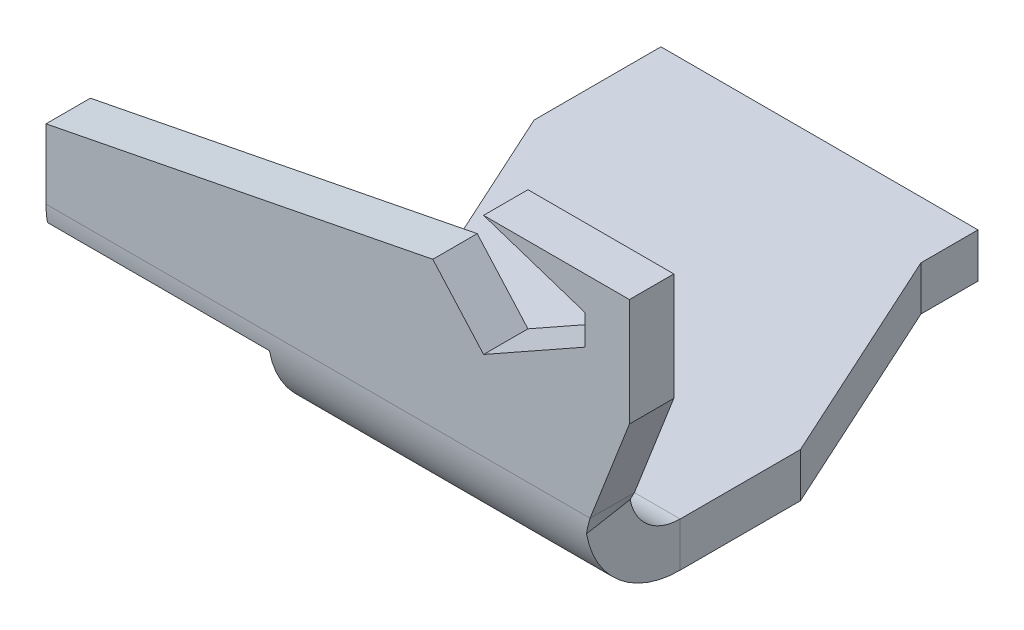
ISO-10303-21;
HEADER;
FILE_DESCRIPTION(('STEP AP214'),'2;1');
FILE_NAME('part.step','',(''),(''),'','','');
FILE_SCHEMA(('AUTOMOTIVE_DESIGN { 1 0 10303 214 1 1 1 1 }'));
ENDSEC;
DATA;
#1=APPLICATION_CONTEXT('core data for automotive mechanical design processes');
#2=APPLICATION_PROTOCOL_DEFINITION('international standard','automotive_design',2000,#1);
#3=PRODUCT_CONTEXT('',#1,'mechanical');
#4=PRODUCT('Part','Part','',(#3));
#5=PRODUCT_RELATED_PRODUCT_CATEGORY('part','',(#4));
#6=PRODUCT_DEFINITION_FORMATION('','',#4);
#7=PRODUCT_DEFINITION_CONTEXT('part definition',#1,'design');
#8=PRODUCT_DEFINITION('design','',#6,#7);
#9=PRODUCT_DEFINITION_SHAPE('','',#8);
#10=(LENGTH_UNIT() NAMED_UNIT(*) SI_UNIT(.MILLI.,.METRE.));
#11=(NAMED_UNIT(*) PLANE_ANGLE_UNIT() SI_UNIT($,.RADIAN.));
#12=(NAMED_UNIT(*) SI_UNIT($,.STERADIAN.) SOLID_ANGLE_UNIT());
#13=UNCERTAINTY_MEASURE_WITH_UNIT(LENGTH_MEASURE(1.E-05),#10,'distance_accuracy_value','');
#14=(GEOMETRIC_REPRESENTATION_CONTEXT(3) GLOBAL_UNCERTAINTY_ASSIGNED_CONTEXT((#13)) GLOBAL_UNIT_ASSIGNED_CONTEXT((#10,
#11,#12)) REPRESENTATION_CONTEXT('',''));
#15=CARTESIAN_POINT('',(0.,0.,0.));
#16=DIRECTION('',(0.,0.,1.));
#17=DIRECTION('',(1.,0.,0.));
#18=AXIS2_PLACEMENT_3D('',#15,#16,#17);
#19=CARTESIAN_POINT('',(3.5,-1.29679211209293,-1.59679211209294));
#20=DIRECTION('',(1.,0.,0.));
#21=DIRECTION('',(0.,0.,1.));
#22=AXIS2_PLACEMENT_3D('',#19,#20,#21);
#23=PLANE('',#22);
#24=DIRECTION('',(0.,0.,1.));
#25=VECTOR('',#24,1.);
#26=CARTESIAN_POINT('',(3.5,-1.29679211209293,-1.59679211209294));
#27=LINE('',#26,#25);
#28=CARTESIAN_POINT('',(3.5,-1.29679211209293,-1.59679211209294));
#29=VERTEX_POINT('',#28);
#30=CARTESIAN_POINT('',(3.5,-1.29679211209293,-0.800000000000006));
#31=VERTEX_POINT('',#30);
#32=EDGE_CURVE('E206',#29,#31,#27,.T.);
#33=ORIENTED_EDGE('',*,*,#32,.T.);
#34=DIRECTION('',(0.,1.,0.));
#35=VECTOR('',#34,1.);
#36=CARTESIAN_POINT('',(3.5,-1.29679211209293,-0.800000000000008));
#37=LINE('',#36,#35);
#38=CARTESIAN_POINT('',(3.5,-0.596792112092931,-0.800000000000001));
#39=VERTEX_POINT('',#38);
#40=EDGE_CURVE('E12',#31,#39,#37,.T.);
#41=ORIENTED_EDGE('',*,*,#40,.T.);
#42=DIRECTION('',(0.,0.,1.));
#43=VECTOR('',#42,1.);
#44=CARTESIAN_POINT('',(3.5,-0.596792112092934,0.80320788790706));
#45=LINE('',#44,#43);
#46=CARTESIAN_POINT('',(3.5,-0.596792112092925,-1.59679211209294));
#47=VERTEX_POINT('',#46);
#48=EDGE_CURVE('E236',#47,#39,#45,.T.);
#49=ORIENTED_EDGE('',*,*,#48,.F.);
#50=DIRECTION('',(0.,-1.,0.));
#51=VECTOR('',#50,1.);
#52=CARTESIAN_POINT('',(3.5,-1.29679211209293,-1.59679211209294));
#53=LINE('',#52,#51);
#54=EDGE_CURVE('E73',#47,#29,#53,.T.);
#55=ORIENTED_EDGE('',*,*,#54,.T.);
#56=EDGE_LOOP('',(#33,#41,#49,#55));
#57=FACE_BOUND('',#56,.T.);
#58=ADVANCED_FACE('F48',(#57),#23,.F.);
#59=CARTESIAN_POINT('',(8.5,-1.29679211209293,0.80320788790706));
#60=DIRECTION('',(-1.,0.,0.));
#61=DIRECTION('',(0.,0.,-1.));
#62=AXIS2_PLACEMENT_3D('',#59,#60,#61);
#63=PLANE('',#62);
#64=DIRECTION('',(0.,0.,1.));
#65=VECTOR('',#64,1.);
#66=CARTESIAN_POINT('',(8.5,-0.596792112092934,0.80320788790706));
#67=LINE('',#66,#65);
#68=CARTESIAN_POINT('',(8.5,-0.596792112092931,-0.800000000000001));
#69=VERTEX_POINT('',#68);
#70=CARTESIAN_POINT('',(8.5,-0.596792112092921,-2.69679211209294));
#71=VERTEX_POINT('',#70);
#72=EDGE_CURVE('E215',#69,#71,#67,.F.);
#73=ORIENTED_EDGE('',*,*,#72,.F.);
#74=DIRECTION('',(0.,-1.,0.));
#75=VECTOR('',#74,1.);
#76=CARTESIAN_POINT('',(8.5,-1.29679211209292,-0.800000000000008));
#77=LINE('',#76,#75);
#78=CARTESIAN_POINT('',(8.5,-1.29679211209293,-0.800000000000002));
#79=VERTEX_POINT('',#78);
#80=EDGE_CURVE('E230',#69,#79,#77,.T.);
#81=ORIENTED_EDGE('',*,*,#80,.T.);
#82=DIRECTION('',(0.,0.,-1.));
#83=VECTOR('',#82,1.);
#84=CARTESIAN_POINT('',(8.5,-1.29679211209293,0.80320788790706));
#85=LINE('',#84,#83);
#86=CARTESIAN_POINT('',(8.5,-1.29679211209292,-2.69679211209294));
#87=VERTEX_POINT('',#86);
#88=EDGE_CURVE('E51',#79,#87,#85,.T.);
#89=ORIENTED_EDGE('',*,*,#88,.T.);
#90=DIRECTION('',(0.,-1.,0.));
#91=VECTOR('',#90,1.);
#92=CARTESIAN_POINT('',(8.5,-1.29679211209292,-2.69679211209294));
#93=LINE('',#92,#91);
#94=EDGE_CURVE('E190',#71,#87,#93,.T.);
#95=ORIENTED_EDGE('',*,*,#94,.F.);
#96=EDGE_LOOP('',(#73,#81,#89,#95));
#97=FACE_BOUND('',#96,.T.);
#98=ADVANCED_FACE('F245',(#97),#63,.F.);
#99=CARTESIAN_POINT('',(0.,-1.29679211209293,0.803207887907058));
#100=DIRECTION('',(0.,-1.,0.));
#101=DIRECTION('',(1.,0.,0.));
#102=AXIS2_PLACEMENT_3D('',#99,#100,#101);
#103=PLANE('',#102);
#104=ORIENTED_EDGE('',*,*,#88,.F.);
#105=DIRECTION('',(-1.,0.,0.));
#106=VECTOR('',#105,1.);
#107=CARTESIAN_POINT('',(0.,-1.29679211209293,-0.800000000000008));
#108=LINE('',#107,#106);
#109=EDGE_CURVE('E226',#79,#31,#108,.T.);
#110=ORIENTED_EDGE('',*,*,#109,.T.);
#111=ORIENTED_EDGE('',*,*,#32,.F.);
#112=DIRECTION('',(0.415759760267794,0.,0.9094744755858));
#113=VECTOR('',#112,1.);
#114=CARTESIAN_POINT('',(1.9,-1.29679211209291,-5.09679211209294));
#115=LINE('',#114,#113);
#116=CARTESIAN_POINT('',(1.9,-1.29679211209291,-5.09679211209294));
#117=VERTEX_POINT('',#116);
#118=EDGE_CURVE('E238',#117,#29,#115,.T.);
#119=ORIENTED_EDGE('',*,*,#118,.F.);
#120=DIRECTION('',(0.,0.,1.));
#121=VECTOR('',#120,1.);
#122=CARTESIAN_POINT('',(1.9,-1.29679211209291,-7.09679211209294));
#123=LINE('',#122,#121);
#124=CARTESIAN_POINT('',(1.9,-1.29679211209291,-7.09679211209294));
#125=VERTEX_POINT('',#124);
#126=EDGE_CURVE('E291',#125,#117,#123,.T.);
#127=ORIENTED_EDGE('',*,*,#126,.F.);
#128=DIRECTION('',(-1.,0.,0.));
#129=VECTOR('',#128,1.);
#130=CARTESIAN_POINT('',(6.9,-1.29679211209291,-7.09679211209294));
#131=LINE('',#130,#129);
#132=CARTESIAN_POINT('',(6.9,-1.29679211209291,-7.09679211209294));
#133=VERTEX_POINT('',#132);
#134=EDGE_CURVE('E200',#133,#125,#131,.T.);
#135=ORIENTED_EDGE('',*,*,#134,.F.);
#136=DIRECTION('',(0.,0.,-1.));
#137=VECTOR('',#136,1.);
#138=CARTESIAN_POINT('',(6.9,-1.29679211209291,-6.19679211209295));
#139=LINE('',#138,#137);
#140=CARTESIAN_POINT('',(6.9,-1.29679211209291,-6.19679211209295));
#141=VERTEX_POINT('',#140);
#142=EDGE_CURVE('E182',#141,#133,#139,.T.);
#143=ORIENTED_EDGE('',*,*,#142,.F.);
#144=DIRECTION('',(-0.415759760267794,0.,-0.909474475585801));
#145=VECTOR('',#144,1.);
#146=CARTESIAN_POINT('',(8.5,-1.29679211209292,-2.69679211209294));
#147=LINE('',#146,#145);
#148=EDGE_CURVE('E197',#87,#141,#147,.T.);
#149=ORIENTED_EDGE('',*,*,#148,.F.);
#150=EDGE_LOOP('',(#104,#110,#111,#119,#127,#135,#143,#149));
#151=FACE_BOUND('',#150,.T.);
#152=ADVANCED_FACE('F196',(#151),#103,.T.);
#153=CARTESIAN_POINT('',(6.9,-1.29679211209291,-7.09679211209294));
#154=DIRECTION('',(0.,0.,1.));
#155=DIRECTION('',(-1.,0.,0.));
#156=AXIS2_PLACEMENT_3D('',#153,#154,#155);
#157=PLANE('',#156);
#158=DIRECTION('',(0.,-1.,0.));
#159=VECTOR('',#158,1.);
#160=CARTESIAN_POINT('',(1.9,-1.29679211209291,-7.09679211209294));
#161=LINE('',#160,#159);
#162=CARTESIAN_POINT('',(1.9,-0.596792112092906,-7.09679211209294));
#163=VERTEX_POINT('',#162);
#164=EDGE_CURVE('E224',#163,#125,#161,.T.);
#165=ORIENTED_EDGE('',*,*,#164,.F.);
#166=DIRECTION('',(1.,0.,0.));
#167=VECTOR('',#166,1.);
#168=CARTESIAN_POINT('',(0.,-0.596792112092906,-7.09679211209294));
#169=LINE('',#168,#167);
#170=CARTESIAN_POINT('',(6.9,-0.596792112092906,-7.09679211209294));
#171=VERTEX_POINT('',#170);
#172=EDGE_CURVE('E217',#171,#163,#169,.F.);
#173=ORIENTED_EDGE('',*,*,#172,.F.);
#174=DIRECTION('',(0.,-1.,0.));
#175=VECTOR('',#174,1.);
#176=CARTESIAN_POINT('',(6.9,-1.29679211209291,-7.09679211209294));
#177=LINE('',#176,#175);
#178=EDGE_CURVE('E189',#171,#133,#177,.T.);
#179=ORIENTED_EDGE('',*,*,#178,.T.);
#180=ORIENTED_EDGE('',*,*,#134,.T.);
#181=EDGE_LOOP('',(#165,#173,#179,#180));
#182=FACE_BOUND('',#181,.T.);
#183=ADVANCED_FACE('F342',(#182),#157,.F.);
#184=CARTESIAN_POINT('',(6.9,-1.29679211209291,-6.19679211209295));
#185=DIRECTION('',(-1.,0.,0.));
#186=DIRECTION('',(0.,0.,-1.));
#187=AXIS2_PLACEMENT_3D('',#184,#185,#186);
#188=PLANE('',#187);
#189=ORIENTED_EDGE('',*,*,#178,.F.);
#190=DIRECTION('',(0.,0.,1.));
#191=VECTOR('',#190,1.);
#192=CARTESIAN_POINT('',(6.9,-0.596792112092934,0.80320788790706));
#193=LINE('',#192,#191);
#194=CARTESIAN_POINT('',(6.9,-0.596792112092909,-6.19679211209294));
#195=VERTEX_POINT('',#194);
#196=EDGE_CURVE('E184',#195,#171,#193,.F.);
#197=ORIENTED_EDGE('',*,*,#196,.F.);
#198=DIRECTION('',(0.,-1.,0.));
#199=VECTOR('',#198,1.);
#200=CARTESIAN_POINT('',(6.9,-1.29679211209291,-6.19679211209295));
#201=LINE('',#200,#199);
#202=EDGE_CURVE('E179',#195,#141,#201,.T.);
#203=ORIENTED_EDGE('',*,*,#202,.T.);
#204=ORIENTED_EDGE('',*,*,#142,.T.);
#205=EDGE_LOOP('',(#189,#197,#203,#204));
#206=FACE_BOUND('',#205,.T.);
#207=ADVANCED_FACE('F181',(#206),#188,.F.);
#208=CARTESIAN_POINT('',(8.5,-1.29679211209292,-2.69679211209294));
#209=DIRECTION('',(-0.909474475585801,0.,0.415759760267794));
#210=DIRECTION('',(-0.415759760267794,0.,-0.909474475585801));
#211=AXIS2_PLACEMENT_3D('',#208,#209,#210);
#212=PLANE('',#211);
#213=ORIENTED_EDGE('',*,*,#202,.F.);
#214=DIRECTION('',(-0.415759760267794,0.,-0.909474475585801));
#215=VECTOR('',#214,1.);
#216=CARTESIAN_POINT('',(8.5,-0.596792112092922,-2.69679211209294));
#217=LINE('',#216,#215);
#218=EDGE_CURVE('E213',#71,#195,#217,.T.);
#219=ORIENTED_EDGE('',*,*,#218,.F.);
#220=ORIENTED_EDGE('',*,*,#94,.T.);
#221=ORIENTED_EDGE('',*,*,#148,.T.);
#222=EDGE_LOOP('',(#213,#219,#220,#221));
#223=FACE_BOUND('',#222,.T.);
#224=ADVANCED_FACE('F203',(#223),#212,.F.);
#225=CARTESIAN_POINT('',(1.9,-1.29679211209291,-5.09679211209294));
#226=DIRECTION('',(0.9094744755858,0.,-0.415759760267794));
#227=DIRECTION('',(0.415759760267794,0.,0.9094744755858));
#228=AXIS2_PLACEMENT_3D('',#225,#226,#227);
#229=PLANE('',#228);
#230=ORIENTED_EDGE('',*,*,#54,.F.);
#231=DIRECTION('',(0.415759760267794,0.,0.9094744755858));
#232=VECTOR('',#231,1.);
#233=CARTESIAN_POINT('',(1.9,-0.596792112092913,-5.09679211209294));
#234=LINE('',#233,#232);
#235=CARTESIAN_POINT('',(1.9,-0.596792112092913,-5.09679211209294));
#236=VERTEX_POINT('',#235);
#237=EDGE_CURVE('E209',#236,#47,#234,.T.);
#238=ORIENTED_EDGE('',*,*,#237,.F.);
#239=DIRECTION('',(0.,-1.,0.));
#240=VECTOR('',#239,1.);
#241=CARTESIAN_POINT('',(1.9,-1.29679211209291,-5.09679211209294));
#242=LINE('',#241,#240);
#243=EDGE_CURVE('E101',#236,#117,#242,.T.);
#244=ORIENTED_EDGE('',*,*,#243,.T.);
#245=ORIENTED_EDGE('',*,*,#118,.T.);
#246=EDGE_LOOP('',(#230,#238,#244,#245));
#247=FACE_BOUND('',#246,.T.);
#248=ADVANCED_FACE('F335',(#247),#229,.F.);
#249=CARTESIAN_POINT('',(1.9,-1.29679211209291,-7.09679211209294));
#250=DIRECTION('',(1.,0.,0.));
#251=DIRECTION('',(0.,0.,1.));
#252=AXIS2_PLACEMENT_3D('',#249,#250,#251);
#253=PLANE('',#252);
#254=DIRECTION('',(0.,0.,1.));
#255=VECTOR('',#254,1.);
#256=CARTESIAN_POINT('',(1.9,-0.596792112092934,0.80320788790706));
#257=LINE('',#256,#255);
#258=EDGE_CURVE('E212',#163,#236,#257,.T.);
#259=ORIENTED_EDGE('',*,*,#258,.F.);
#260=ORIENTED_EDGE('',*,*,#164,.T.);
#261=ORIENTED_EDGE('',*,*,#126,.T.);
#262=ORIENTED_EDGE('',*,*,#243,.F.);
#263=EDGE_LOOP('',(#259,#260,#261,#262));
#264=FACE_BOUND('',#263,.T.);
#265=ADVANCED_FACE('F294',(#264),#253,.F.);
#266=CARTESIAN_POINT('',(0.,-0.596792112092934,0.80320788790706));
#267=DIRECTION('',(0.,-1.,0.));
#268=DIRECTION('',(1.,0.,0.));
#269=AXIS2_PLACEMENT_3D('',#266,#267,#268);
#270=PLANE('',#269);
#271=DIRECTION('',(-1.,0.,0.));
#272=VECTOR('',#271,1.);
#273=CARTESIAN_POINT('',(0.,-0.596792112092928,-0.800000000000001));
#274=LINE('',#273,#272);
#275=EDGE_CURVE('E56',#69,#39,#274,.T.);
#276=ORIENTED_EDGE('',*,*,#275,.F.);
#277=ORIENTED_EDGE('',*,*,#72,.T.);
#278=ORIENTED_EDGE('',*,*,#218,.T.);
#279=ORIENTED_EDGE('',*,*,#196,.T.);
#280=ORIENTED_EDGE('',*,*,#172,.T.);
#281=ORIENTED_EDGE('',*,*,#258,.T.);
#282=ORIENTED_EDGE('',*,*,#237,.T.);
#283=ORIENTED_EDGE('',*,*,#48,.T.);
#284=EDGE_LOOP('',(#276,#277,#278,#279,#280,#281,#282,#283));
#285=FACE_BOUND('',#284,.T.);
#286=ADVANCED_FACE('F242',(#285),#270,.F.);
#287=CARTESIAN_POINT('',(0.,1.3,0.7));
#288=DIRECTION('',(0.193021860293335,-0.981194456491118,0.));
#289=DIRECTION('',(0.981194456491118,0.193021860293335,0.));
#290=AXIS2_PLACEMENT_3D('',#287,#288,#289);
#291=PLANE('',#290);
#292=DIRECTION('',(0.,0.,1.));
#293=VECTOR('',#292,1.);
#294=CARTESIAN_POINT('',(6.1,2.5,0.7));
#295=LINE('',#294,#293);
#296=CARTESIAN_POINT('',(6.1,2.5,0.));
#297=VERTEX_POINT('',#296);
#298=CARTESIAN_POINT('',(6.1,2.5,0.7));
#299=VERTEX_POINT('',#298);
#300=EDGE_CURVE('E799',#297,#299,#295,.T.);
#301=ORIENTED_EDGE('',*,*,#300,.F.);
#302=DIRECTION('',(0.981194456491118,0.193021860293335,0.));
#303=VECTOR('',#302,1.);
#304=CARTESIAN_POINT('',(0.,1.3,0.));
#305=LINE('',#304,#303);
#306=CARTESIAN_POINT('',(0.,1.3,0.));
#307=VERTEX_POINT('',#306);
#308=EDGE_CURVE('E765',#307,#297,#305,.T.);
#309=ORIENTED_EDGE('',*,*,#308,.F.);
#310=DIRECTION('',(0.,0.,1.));
#311=VECTOR('',#310,1.);
#312=CARTESIAN_POINT('',(0.,1.3,0.7));
#313=LINE('',#312,#311);
#314=CARTESIAN_POINT('',(0.,1.3,0.7));
#315=VERTEX_POINT('',#314);
#316=EDGE_CURVE('E804',#307,#315,#313,.T.);
#317=ORIENTED_EDGE('',*,*,#316,.T.);
#318=DIRECTION('',(0.981194456491118,0.193021860293335,0.));
#319=VECTOR('',#318,1.);
#320=CARTESIAN_POINT('',(0.,1.3,0.7));
#321=LINE('',#320,#319);
#322=EDGE_CURVE('E801',#315,#299,#321,.T.);
#323=ORIENTED_EDGE('',*,*,#322,.T.);
#324=EDGE_LOOP('',(#301,#309,#317,#323));
#325=FACE_BOUND('',#324,.T.);
#326=ADVANCED_FACE('F352',(#325),#291,.F.);
#327=CARTESIAN_POINT('',(6.1,2.5,0.7));
#328=DIRECTION('',(-0.747409318683659,-0.66436383882992,0.));
#329=DIRECTION('',(0.66436383882992,-0.747409318683659,0.));
#330=AXIS2_PLACEMENT_3D('',#327,#328,#329);
#331=PLANE('',#330);
#332=DIRECTION('',(0.,0.,1.));
#333=VECTOR('',#332,1.);
#334=CARTESIAN_POINT('',(6.9,1.6,0.7));
#335=LINE('',#334,#333);
#336=CARTESIAN_POINT('',(6.9,1.6,0.));
#337=VERTEX_POINT('',#336);
#338=CARTESIAN_POINT('',(6.9,1.6,0.7));
#339=VERTEX_POINT('',#338);
#340=EDGE_CURVE('E794',#337,#339,#335,.T.);
#341=ORIENTED_EDGE('',*,*,#340,.F.);
#342=DIRECTION('',(0.66436383882992,-0.747409318683659,0.));
#343=VECTOR('',#342,1.);
#344=CARTESIAN_POINT('',(6.1,2.5,0.));
#345=LINE('',#344,#343);
#346=EDGE_CURVE('E762',#297,#337,#345,.T.);
#347=ORIENTED_EDGE('',*,*,#346,.F.);
#348=ORIENTED_EDGE('',*,*,#300,.T.);
#349=DIRECTION('',(0.66436383882992,-0.747409318683659,0.));
#350=VECTOR('',#349,1.);
#351=CARTESIAN_POINT('',(6.1,2.5,0.7));
#352=LINE('',#351,#350);
#353=EDGE_CURVE('E796',#299,#339,#352,.T.);
#354=ORIENTED_EDGE('',*,*,#353,.T.);
#355=EDGE_LOOP('',(#341,#347,#348,#354));
#356=FACE_BOUND('',#355,.T.);
#357=ADVANCED_FACE('F356',(#356),#331,.F.);
#358=CARTESIAN_POINT('',(6.9,1.6,0.7));
#359=DIRECTION('',(0.490261239632559,-0.871575537124549,0.));
#360=DIRECTION('',(0.871575537124549,0.490261239632559,0.));
#361=AXIS2_PLACEMENT_3D('',#358,#359,#360);
#362=PLANE('',#361);
#363=DIRECTION('',(0.,0.,1.));
#364=VECTOR('',#363,1.);
#365=CARTESIAN_POINT('',(8.5,2.5,0.7));
#366=LINE('',#365,#364);
#367=CARTESIAN_POINT('',(8.5,2.5,0.));
#368=VERTEX_POINT('',#367);
#369=CARTESIAN_POINT('',(8.5,2.5,0.7));
#370=VERTEX_POINT('',#369);
#371=EDGE_CURVE('E789',#368,#370,#366,.T.);
#372=ORIENTED_EDGE('',*,*,#371,.F.);
#373=DIRECTION('',(0.871575537124549,0.490261239632559,0.));
#374=VECTOR('',#373,1.);
#375=CARTESIAN_POINT('',(6.9,1.6,0.));
#376=LINE('',#375,#374);
#377=EDGE_CURVE('E759',#337,#368,#376,.T.);
#378=ORIENTED_EDGE('',*,*,#377,.F.);
#379=ORIENTED_EDGE('',*,*,#340,.T.);
#380=DIRECTION('',(0.871575537124549,0.490261239632559,0.));
#381=VECTOR('',#380,1.);
#382=CARTESIAN_POINT('',(6.9,1.6,0.7));
#383=LINE('',#382,#381);
#384=EDGE_CURVE('E791',#339,#370,#383,.T.);
#385=ORIENTED_EDGE('',*,*,#384,.T.);
#386=EDGE_LOOP('',(#372,#378,#379,#385));
#387=FACE_BOUND('',#386,.T.);
#388=ADVANCED_FACE('F415',(#387),#362,.F.);
#389=CARTESIAN_POINT('',(8.5,2.5,0.7));
#390=DIRECTION('',(1.,0.,0.));
#391=DIRECTION('',(0.,1.,0.));
#392=AXIS2_PLACEMENT_3D('',#389,#390,#391);
#393=PLANE('',#392);
#394=DIRECTION('',(0.,0.,1.));
#395=VECTOR('',#394,1.);
#396=CARTESIAN_POINT('',(8.5,2.97213114754099,0.7));
#397=LINE('',#396,#395);
#398=CARTESIAN_POINT('',(8.5,2.97213114754099,0.));
#399=VERTEX_POINT('',#398);
#400=CARTESIAN_POINT('',(8.5,2.97213114754099,0.7));
#401=VERTEX_POINT('',#400);
#402=EDGE_CURVE('E784',#399,#401,#397,.T.);
#403=ORIENTED_EDGE('',*,*,#402,.F.);
#404=DIRECTION('',(0.,1.,0.));
#405=VECTOR('',#404,1.);
#406=CARTESIAN_POINT('',(8.5,0.,0.));
#407=LINE('',#406,#405);
#408=EDGE_CURVE('E756',#368,#399,#407,.T.);
#409=ORIENTED_EDGE('',*,*,#408,.F.);
#410=ORIENTED_EDGE('',*,*,#371,.T.);
#411=DIRECTION('',(0.,1.,0.));
#412=VECTOR('',#411,1.);
#413=CARTESIAN_POINT('',(8.5,2.5,0.7));
#414=LINE('',#413,#412);
#415=EDGE_CURVE('E786',#370,#401,#414,.T.);
#416=ORIENTED_EDGE('',*,*,#415,.T.);
#417=EDGE_LOOP('',(#403,#409,#410,#416));
#418=FACE_BOUND('',#417,.T.);
#419=ADVANCED_FACE('F426',(#418),#393,.F.);
#420=CARTESIAN_POINT('',(8.5,2.97213114754099,0.7));
#421=DIRECTION('',(0.313307257376607,0.949651811178786,0.));
#422=DIRECTION('',(-0.949651811178786,0.313307257376607,0.));
#423=AXIS2_PLACEMENT_3D('',#420,#421,#422);
#424=PLANE('',#423);
#425=DIRECTION('',(0.,0.,1.));
#426=VECTOR('',#425,1.);
#427=CARTESIAN_POINT('',(6.9,3.5,0.7));
#428=LINE('',#427,#426);
#429=CARTESIAN_POINT('',(6.9,3.5,0.));
#430=VERTEX_POINT('',#429);
#431=CARTESIAN_POINT('',(6.9,3.5,0.7));
#432=VERTEX_POINT('',#431);
#433=EDGE_CURVE('E779',#430,#432,#428,.T.);
#434=ORIENTED_EDGE('',*,*,#433,.F.);
#435=DIRECTION('',(-0.949651811178786,0.313307257376607,0.));
#436=VECTOR('',#435,1.);
#437=CARTESIAN_POINT('',(8.5,2.97213114754099,0.));
#438=LINE('',#437,#436);
#439=EDGE_CURVE('E753',#399,#430,#438,.T.);
#440=ORIENTED_EDGE('',*,*,#439,.F.);
#441=ORIENTED_EDGE('',*,*,#402,.T.);
#442=DIRECTION('',(-0.949651811178786,0.313307257376607,0.));
#443=VECTOR('',#442,1.);
#444=CARTESIAN_POINT('',(8.5,2.97213114754099,0.7));
#445=LINE('',#444,#443);
#446=EDGE_CURVE('E781',#401,#432,#445,.T.);
#447=ORIENTED_EDGE('',*,*,#446,.T.);
#448=EDGE_LOOP('',(#434,#440,#441,#447));
#449=FACE_BOUND('',#448,.T.);
#450=ADVANCED_FACE('F437',(#449),#424,.F.);
#451=CARTESIAN_POINT('',(6.9,3.5,0.7));
#452=DIRECTION('',(0.,-1.,0.));
#453=DIRECTION('',(1.,0.,0.));
#454=AXIS2_PLACEMENT_3D('',#451,#452,#453);
#455=PLANE('',#454);
#456=DIRECTION('',(0.,0.,1.));
#457=VECTOR('',#456,1.);
#458=CARTESIAN_POINT('',(9.2,3.5,0.7));
#459=LINE('',#458,#457);
#460=CARTESIAN_POINT('',(9.2,3.5,0.));
#461=VERTEX_POINT('',#460);
#462=CARTESIAN_POINT('',(9.2,3.5,0.7));
#463=VERTEX_POINT('',#462);
#464=EDGE_CURVE('E774',#461,#463,#459,.T.);
#465=ORIENTED_EDGE('',*,*,#464,.F.);
#466=DIRECTION('',(1.,0.,0.));
#467=VECTOR('',#466,1.);
#468=CARTESIAN_POINT('',(0.,3.5,0.));
#469=LINE('',#468,#467);
#470=EDGE_CURVE('E750',#430,#461,#469,.T.);
#471=ORIENTED_EDGE('',*,*,#470,.F.);
#472=ORIENTED_EDGE('',*,*,#433,.T.);
#473=DIRECTION('',(1.,0.,0.));
#474=VECTOR('',#473,1.);
#475=CARTESIAN_POINT('',(6.9,3.5,0.7));
#476=LINE('',#475,#474);
#477=EDGE_CURVE('E776',#432,#463,#476,.T.);
#478=ORIENTED_EDGE('',*,*,#477,.T.);
#479=EDGE_LOOP('',(#465,#471,#472,#478));
#480=FACE_BOUND('',#479,.T.);
#481=ADVANCED_FACE('F448',(#480),#455,.F.);
#482=CARTESIAN_POINT('',(9.2,3.5,0.7));
#483=DIRECTION('',(-1.,0.,0.));
#484=DIRECTION('',(0.,-1.,0.));
#485=AXIS2_PLACEMENT_3D('',#482,#483,#484);
#486=PLANE('',#485);
#487=DIRECTION('',(0.,0.,1.));
#488=VECTOR('',#487,1.);
#489=CARTESIAN_POINT('',(9.2,1.8,0.7));
#490=LINE('',#489,#488);
#491=CARTESIAN_POINT('',(9.2,1.8,0.));
#492=VERTEX_POINT('',#491);
#493=CARTESIAN_POINT('',(9.2,1.8,0.7));
#494=VERTEX_POINT('',#493);
#495=EDGE_CURVE('E769',#492,#494,#490,.T.);
#496=ORIENTED_EDGE('',*,*,#495,.F.);
#497=DIRECTION('',(0.,1.,0.));
#498=VECTOR('',#497,1.);
#499=CARTESIAN_POINT('',(9.2,0.,0.));
#500=LINE('',#499,#498);
#501=EDGE_CURVE('E747',#461,#492,#500,.F.);
#502=ORIENTED_EDGE('',*,*,#501,.F.);
#503=ORIENTED_EDGE('',*,*,#464,.T.);
#504=DIRECTION('',(0.,-1.,0.));
#505=VECTOR('',#504,1.);
#506=CARTESIAN_POINT('',(9.2,3.5,0.7));
#507=LINE('',#506,#505);
#508=EDGE_CURVE('E771',#463,#494,#507,.T.);
#509=ORIENTED_EDGE('',*,*,#508,.T.);
#510=EDGE_LOOP('',(#496,#502,#503,#509));
#511=FACE_BOUND('',#510,.T.);
#512=ADVANCED_FACE('F459',(#511),#486,.F.);
#513=CARTESIAN_POINT('',(0.,0.,0.7));
#514=DIRECTION('',(0.,0.,1.));
#515=DIRECTION('',(1.,0.,0.));
#516=AXIS2_PLACEMENT_3D('',#513,#514,#515);
#517=PLANE('',#516);
#518=DIRECTION('',(-1.,0.,0.));
#519=VECTOR('',#518,1.);
#520=CARTESIAN_POINT('',(0.,0.203207887907069,0.7));
#521=LINE('',#520,#519);
#522=CARTESIAN_POINT('',(8.57902528974164,0.203207887907069,0.7));
#523=VERTEX_POINT('',#522);
#524=CARTESIAN_POINT('',(0.,0.203207887907069,0.7));
#525=VERTEX_POINT('',#524);
#526=EDGE_CURVE('E810',#523,#525,#521,.T.);
#527=ORIENTED_EDGE('',*,*,#526,.F.);
#528=DIRECTION('',(-0.362446261154948,-0.932004671541296,0.));
#529=VECTOR('',#528,1.);
#530=CARTESIAN_POINT('',(9.2,1.8,0.7));
#531=LINE('',#530,#529);
#532=EDGE_CURVE('E302',#494,#523,#531,.T.);
#533=ORIENTED_EDGE('',*,*,#532,.F.);
#534=ORIENTED_EDGE('',*,*,#508,.F.);
#535=ORIENTED_EDGE('',*,*,#477,.F.);
#536=ORIENTED_EDGE('',*,*,#446,.F.);
#537=ORIENTED_EDGE('',*,*,#415,.F.);
#538=ORIENTED_EDGE('',*,*,#384,.F.);
#539=ORIENTED_EDGE('',*,*,#353,.F.);
#540=ORIENTED_EDGE('',*,*,#322,.F.);
#541=DIRECTION('',(0.,1.,0.));
#542=VECTOR('',#541,1.);
#543=CARTESIAN_POINT('',(0.,0.,0.7));
#544=LINE('',#543,#542);
#545=EDGE_CURVE('E110',#525,#315,#544,.T.);
#546=ORIENTED_EDGE('',*,*,#545,.F.);
#547=EDGE_LOOP('',(#527,#533,#534,#535,#536,#537,#538,#539,#540,#546));
#548=FACE_BOUND('',#547,.T.);
#549=ADVANCED_FACE('F325',(#548),#517,.T.);
#550=CARTESIAN_POINT('',(9.2,1.8,0.7));
#551=DIRECTION('',(-0.932004671541296,0.362446261154948,0.));
#552=DIRECTION('',(-0.362446261154948,-0.932004671541296,0.));
#553=AXIS2_PLACEMENT_3D('',#550,#551,#552);
#554=PLANE('',#553);
#555=CARTESIAN_POINT('',(8.57902528974164,0.203207887907069,0.));
#556=CARTESIAN_POINT('',(8.57902528974164,0.203207887907069,0.7));
#557=B_SPLINE_CURVE_WITH_KNOTS('',1,(#555,#556),.UNSPECIFIED.,.F.,.F.,(2,2),(0.,1.),.UNSPECIFIED.);
#558=CARTESIAN_POINT('',(8.57902528974164,0.203207887907074,0.));
#559=VERTEX_POINT('',#558);
#560=EDGE_CURVE('E806',#559,#523,#557,.T.);
#561=ORIENTED_EDGE('',*,*,#560,.F.);
#562=DIRECTION('',(-0.362446261154948,-0.932004671541296,0.));
#563=VECTOR('',#562,1.);
#564=CARTESIAN_POINT('',(9.2,1.8,0.));
#565=LINE('',#564,#563);
#566=EDGE_CURVE('E299',#492,#559,#565,.T.);
#567=ORIENTED_EDGE('',*,*,#566,.F.);
#568=ORIENTED_EDGE('',*,*,#495,.T.);
#569=ORIENTED_EDGE('',*,*,#532,.T.);
#570=EDGE_LOOP('',(#561,#567,#568,#569));
#571=FACE_BOUND('',#570,.T.);
#572=ADVANCED_FACE('F314',(#571),#554,.F.);
#573=CARTESIAN_POINT('',(0.,0.,0.));
#574=DIRECTION('',(0.,0.,1.));
#575=DIRECTION('',(1.,0.,0.));
#576=AXIS2_PLACEMENT_3D('',#573,#574,#575);
#577=PLANE('',#576);
#578=ORIENTED_EDGE('',*,*,#566,.T.);
#579=DIRECTION('',(-1.,0.,0.));
#580=VECTOR('',#579,1.);
#581=CARTESIAN_POINT('',(0.,0.203207887907074,0.));
#582=LINE('',#581,#580);
#583=CARTESIAN_POINT('',(0.,0.203207887907074,0.));
#584=VERTEX_POINT('',#583);
#585=EDGE_CURVE('E301',#559,#584,#582,.T.);
#586=ORIENTED_EDGE('',*,*,#585,.T.);
#587=DIRECTION('',(0.,1.,0.));
#588=VECTOR('',#587,1.);
#589=CARTESIAN_POINT('',(0.,0.,0.));
#590=LINE('',#589,#588);
#591=EDGE_CURVE('E307',#584,#307,#590,.T.);
#592=ORIENTED_EDGE('',*,*,#591,.T.);
#593=ORIENTED_EDGE('',*,*,#308,.T.);
#594=ORIENTED_EDGE('',*,*,#346,.T.);
#595=ORIENTED_EDGE('',*,*,#377,.T.);
#596=ORIENTED_EDGE('',*,*,#408,.T.);
#597=ORIENTED_EDGE('',*,*,#439,.T.);
#598=ORIENTED_EDGE('',*,*,#470,.T.);
#599=ORIENTED_EDGE('',*,*,#501,.T.);
#600=EDGE_LOOP('',(#578,#586,#592,#593,#594,#595,#596,#597,#598,#599));
#601=FACE_BOUND('',#600,.T.);
#602=ADVANCED_FACE('F324',(#601),#577,.F.);
#603=CARTESIAN_POINT('',(0.,0.,0.7));
#604=DIRECTION('',(1.,0.,0.));
#605=DIRECTION('',(0.,1.,0.));
#606=AXIS2_PLACEMENT_3D('',#603,#604,#605);
#607=PLANE('',#606);
#608=DIRECTION('',(0.,0.,-1.));
#609=VECTOR('',#608,1.);
#610=CARTESIAN_POINT('',(0.,0.203207887907069,0.700000000000001));
#611=LINE('',#610,#609);
#612=EDGE_CURVE('E807',#525,#584,#611,.T.);
#613=ORIENTED_EDGE('',*,*,#612,.F.);
#614=ORIENTED_EDGE('',*,*,#545,.T.);
#615=ORIENTED_EDGE('',*,*,#316,.F.);
#616=ORIENTED_EDGE('',*,*,#591,.F.);
#617=EDGE_LOOP('',(#613,#614,#615,#616));
#618=FACE_BOUND('',#617,.T.);
#619=ADVANCED_FACE('F330',(#618),#607,.F.);
#620=CARTESIAN_POINT('',(8.5,0.203207887907069,-0.8));
#621=DIRECTION('',(1.,0.,0.));
#622=DIRECTION('',(0.,0.,-1.));
#623=AXIS2_PLACEMENT_3D('',#620,#621,#622);
#624=PLANE('',#623);
#625=ORIENTED_EDGE('',*,*,#80,.F.);
#626=CARTESIAN_POINT('',(8.5,0.203207887907069,-0.8));
#627=DIRECTION('',(1.,0.,0.));
#628=DIRECTION('',(0.,1.,0.));
#629=AXIS2_PLACEMENT_3D('',#626,#627,#628);
#630=CIRCLE('',#629,0.8);
#631=CARTESIAN_POINT('',(8.5,0.0625803739564598,-0.0124570473173726));
#632=VERTEX_POINT('',#631);
#633=EDGE_CURVE('E281',#69,#632,#630,.F.);
#634=ORIENTED_EDGE('',*,*,#633,.T.);
#635=CARTESIAN_POINT('',(8.5,-0.0604687007503244,0.676643036279926));
#636=CARTESIAN_POINT('',(8.5,0.0625803739564593,-0.0124570473173727));
#637=B_SPLINE_CURVE_WITH_KNOTS('',1,(#635,#636),.UNSPECIFIED.,.F.,.F.,(2,2),(0.,1.),.UNSPECIFIED.);
#638=CARTESIAN_POINT('',(8.5,-0.0604687007503234,0.676643036279926));
#639=VERTEX_POINT('',#638);
#640=EDGE_CURVE('E727',#632,#639,#637,.F.);
#641=ORIENTED_EDGE('',*,*,#640,.T.);
#642=CARTESIAN_POINT('',(8.5,0.203207887907069,-0.8));
#643=DIRECTION('',(-1.,0.,0.));
#644=DIRECTION('',(0.,0.,-1.));
#645=AXIS2_PLACEMENT_3D('',#642,#643,#644);
#646=CIRCLE('',#645,1.5);
#647=EDGE_CURVE('E286',#79,#639,#646,.T.);
#648=ORIENTED_EDGE('',*,*,#647,.F.);
#649=EDGE_LOOP('',(#625,#634,#641,#648));
#650=FACE_BOUND('',#649,.T.);
#651=ADVANCED_FACE('F334',(#650),#624,.T.);
#652=CARTESIAN_POINT('',(8.5,-0.0604687007503244,0.676643036279926));
#653=CARTESIAN_POINT('',(8.52634245667467,0.0265090997128796,0.692174216904892));
#654=CARTESIAN_POINT('',(8.55268283306697,0.114854306513771,0.7));
#655=CARTESIAN_POINT('',(8.57902528974164,0.203207887907069,0.7));
#656=CARTESIAN_POINT('',(8.5,0.0625803739564593,-0.0124570473173727));
#657=CARTESIAN_POINT('',(8.52634234261414,0.108968333346832,-0.00417378685000512));
#658=CARTESIAN_POINT('',(8.5526829471275,0.156086181864387,0.));
#659=CARTESIAN_POINT('',(8.57902528974164,0.203207887907069,0.));
#660=B_SPLINE_SURFACE_WITH_KNOTS('',1,3,((#652,#653,#654,#655),(#656,#657,#658,#659)),
.UNSPECIFIED.,.F.,.F.,.F.,(2,2),(4,4),(0.,1.),(0.,1.),.UNSPECIFIED.);
#661=CARTESIAN_POINT('',(8.5,0.0625803739564593,-0.0124570473173727));
#662=CARTESIAN_POINT('',(8.52634234261414,0.108968333346832,-0.00417378685000512));
#663=CARTESIAN_POINT('',(8.5526829471275,0.156086181864387,0.));
#664=CARTESIAN_POINT('',(8.57902528974164,0.203207887907069,0.));
#665=B_SPLINE_CURVE_WITH_KNOTS('',3,(#661,#662,#663,#664),.UNSPECIFIED.,.F.,.F.,(4,4),(0.,1.),.UNSPECIFIED.);
#666=EDGE_CURVE('E682',#632,#559,#665,.T.);
#667=CARTESIAN_POINT('',(8.57902528974164,0.203207887907069,0.7));
#668=CARTESIAN_POINT('',(8.55268283306697,0.114854306513771,0.7));
#669=CARTESIAN_POINT('',(8.52634245667467,0.0265090997128796,0.692174216904892));
#670=CARTESIAN_POINT('',(8.5,-0.0604687007503244,0.676643036279926));
#671=B_SPLINE_CURVE_WITH_KNOTS('',3,(#667,#668,#669,#670),.UNSPECIFIED.,.F.,.F.,(4,4),(0.,1.),.UNSPECIFIED.);
#672=EDGE_CURVE('E689',#639,#523,#671,.F.);
#673=ORIENTED_EDGE('',*,*,#640,.F.);
#674=ORIENTED_EDGE('',*,*,#666,.T.);
#675=ORIENTED_EDGE('',*,*,#560,.T.);
#676=ORIENTED_EDGE('',*,*,#672,.F.);
#677=EDGE_LOOP('',(#673,#674,#675,#676));
#678=FACE_BOUND('',#677,.T.);
#679=ADVANCED_FACE('F509',(#678),#660,.T.);
#680=CARTESIAN_POINT('',(0.,0.203207887907069,-0.8));
#681=DIRECTION('',(-1.,0.,0.));
#682=DIRECTION('',(0.,-1.,0.));
#683=AXIS2_PLACEMENT_3D('',#680,#681,#682);
#684=PLANE('',#683);
#685=ORIENTED_EDGE('',*,*,#612,.T.);
#686=CARTESIAN_POINT('',(0.,0.203207887907069,-0.8));
#687=DIRECTION('',(1.,0.,0.));
#688=DIRECTION('',(0.,1.,0.));
#689=AXIS2_PLACEMENT_3D('',#686,#687,#688);
#690=CIRCLE('',#689,0.8);
#691=CARTESIAN_POINT('',(0.,0.0625803739564586,-0.0124570473173728));
#692=VERTEX_POINT('',#691);
#693=EDGE_CURVE('E822',#584,#692,#690,.T.);
#694=ORIENTED_EDGE('',*,*,#693,.T.);
#695=DIRECTION('',(0.,-0.175784392438264,0.984428690853284));
#696=VECTOR('',#695,1.);
#697=CARTESIAN_POINT('',(0.,-0.0604687007503268,0.676643036279926));
#698=LINE('',#697,#696);
#699=CARTESIAN_POINT('',(0.,-0.0604687007503268,0.676643036279926));
#700=VERTEX_POINT('',#699);
#701=EDGE_CURVE('E745',#692,#700,#698,.T.);
#702=ORIENTED_EDGE('',*,*,#701,.T.);
#703=CARTESIAN_POINT('',(0.,0.203207887907069,-0.8));
#704=DIRECTION('',(1.,0.,0.));
#705=DIRECTION('',(0.,-1.,0.));
#706=AXIS2_PLACEMENT_3D('',#703,#704,#705);
#707=CIRCLE('',#706,1.5);
#708=EDGE_CURVE('E820',#525,#700,#707,.T.);
#709=ORIENTED_EDGE('',*,*,#708,.F.);
#710=EDGE_LOOP('',(#685,#694,#702,#709));
#711=FACE_BOUND('',#710,.T.);
#712=ADVANCED_FACE('F520',(#711),#684,.T.);
#713=CARTESIAN_POINT('',(1.75,-0.0604687007503258,0.676643036279926));
#714=DIRECTION('',(0.,-0.984428690853284,-0.175784392438263));
#715=DIRECTION('',(1.,0.,0.));
#716=AXIS2_PLACEMENT_3D('',#713,#714,#715);
#717=PLANE('',#716);
#718=ORIENTED_EDGE('',*,*,#701,.F.);
#719=DIRECTION('',(1.,0.,0.));
#720=VECTOR('',#719,1.);
#721=CARTESIAN_POINT('',(-4.50553214621108,0.0625803739564586,-0.0124570473173728));
#722=LINE('',#721,#720);
#723=CARTESIAN_POINT('',(3.5,0.0625803739564586,-0.0124570473173728));
#724=VERTEX_POINT('',#723);
#725=EDGE_CURVE('E287',#692,#724,#722,.T.);
#726=ORIENTED_EDGE('',*,*,#725,.T.);
#727=DIRECTION('',(0.,-0.175784392438263,0.984428690853284));
#728=VECTOR('',#727,1.);
#729=CARTESIAN_POINT('',(3.5,-0.0604687007503248,0.676643036279926));
#730=LINE('',#729,#728);
#731=CARTESIAN_POINT('',(3.5,-0.0604687007503248,0.676643036279926));
#732=VERTEX_POINT('',#731);
#733=EDGE_CURVE('E284',#724,#732,#730,.T.);
#734=ORIENTED_EDGE('',*,*,#733,.T.);
#735=DIRECTION('',(1.,0.,0.));
#736=VECTOR('',#735,1.);
#737=CARTESIAN_POINT('',(3.5,-0.0604687007503248,0.676643036279926));
#738=LINE('',#737,#736);
#739=EDGE_CURVE('E824',#700,#732,#738,.T.);
#740=ORIENTED_EDGE('',*,*,#739,.F.);
#741=EDGE_LOOP('',(#718,#726,#734,#740));
#742=FACE_BOUND('',#741,.T.);
#743=ADVANCED_FACE('F531',(#742),#717,.T.);
#744=CARTESIAN_POINT('',(3.5,0.203207887907069,-0.8));
#745=DIRECTION('',(-1.,0.,0.));
#746=DIRECTION('',(0.,0.,1.));
#747=AXIS2_PLACEMENT_3D('',#744,#745,#746);
#748=PLANE('',#747);
#749=CARTESIAN_POINT('',(3.5,0.203207887907069,-0.8));
#750=DIRECTION('',(1.,0.,0.));
#751=DIRECTION('',(0.,1.,0.));
#752=AXIS2_PLACEMENT_3D('',#749,#750,#751);
#753=CIRCLE('',#752,0.8);
#754=EDGE_CURVE('E278',#724,#39,#753,.T.);
#755=ORIENTED_EDGE('',*,*,#754,.T.);
#756=ORIENTED_EDGE('',*,*,#40,.F.);
#757=CARTESIAN_POINT('',(3.5,0.203207887907069,-0.8));
#758=DIRECTION('',(1.,0.,0.));
#759=DIRECTION('',(0.,0.,1.));
#760=AXIS2_PLACEMENT_3D('',#757,#758,#759);
#761=CIRCLE('',#760,1.5);
#762=EDGE_CURVE('E64',#732,#31,#761,.T.);
#763=ORIENTED_EDGE('',*,*,#762,.F.);
#764=ORIENTED_EDGE('',*,*,#733,.F.);
#765=EDGE_LOOP('',(#755,#756,#763,#764));
#766=FACE_BOUND('',#765,.T.);
#767=ADVANCED_FACE('F283',(#766),#748,.T.);
#768=CARTESIAN_POINT('',(-4.50553214621108,0.203207887907069,-0.8));
#769=DIRECTION('',(1.,0.,0.));
#770=DIRECTION('',(0.,1.,0.));
#771=AXIS2_PLACEMENT_3D('',#768,#769,#770);
#772=CYLINDRICAL_SURFACE('',#771,1.5);
#773=ORIENTED_EDGE('',*,*,#739,.T.);
#774=ORIENTED_EDGE('',*,*,#762,.T.);
#775=ORIENTED_EDGE('',*,*,#109,.F.);
#776=ORIENTED_EDGE('',*,*,#647,.T.);
#777=ORIENTED_EDGE('',*,*,#672,.T.);
#778=ORIENTED_EDGE('',*,*,#526,.T.);
#779=ORIENTED_EDGE('',*,*,#708,.T.);
#780=EDGE_LOOP('',(#773,#774,#775,#776,#777,#778,#779));
#781=FACE_BOUND('',#780,.T.);
#782=ADVANCED_FACE('F552',(#781),#772,.T.);
#783=CARTESIAN_POINT('',(-4.50553214621108,0.203207887907069,-0.8));
#784=DIRECTION('',(1.,0.,0.));
#785=DIRECTION('',(0.,1.,0.));
#786=AXIS2_PLACEMENT_3D('',#783,#784,#785);
#787=CYLINDRICAL_SURFACE('',#786,0.8);
#788=ORIENTED_EDGE('',*,*,#725,.F.);
#789=ORIENTED_EDGE('',*,*,#693,.F.);
#790=ORIENTED_EDGE('',*,*,#585,.F.);
#791=ORIENTED_EDGE('',*,*,#666,.F.);
#792=ORIENTED_EDGE('',*,*,#633,.F.);
#793=ORIENTED_EDGE('',*,*,#275,.T.);
#794=ORIENTED_EDGE('',*,*,#754,.F.);
#795=EDGE_LOOP('',(#788,#789,#790,#791,#792,#793,#794));
#796=FACE_BOUND('',#795,.T.);
#797=ADVANCED_FACE('F277',(#796),#787,.F.);
#798=CLOSED_SHELL('',(#58,#98,#152,#183,#207,#224,#248,#265,#286,#326,#357,#388,#419,#450,#481,
#512,#549,#572,#602,#619,#651,#679,#712,#743,#767,#782,#797));
#799=MANIFOLD_SOLID_BREP('B2',#798);
#800=ADVANCED_BREP_SHAPE_REPRESENTATION('',(#18,#799),#14);
#801=SHAPE_DEFINITION_REPRESENTATION(#9,#800);
ENDSEC;
END-ISO-10303-21;
